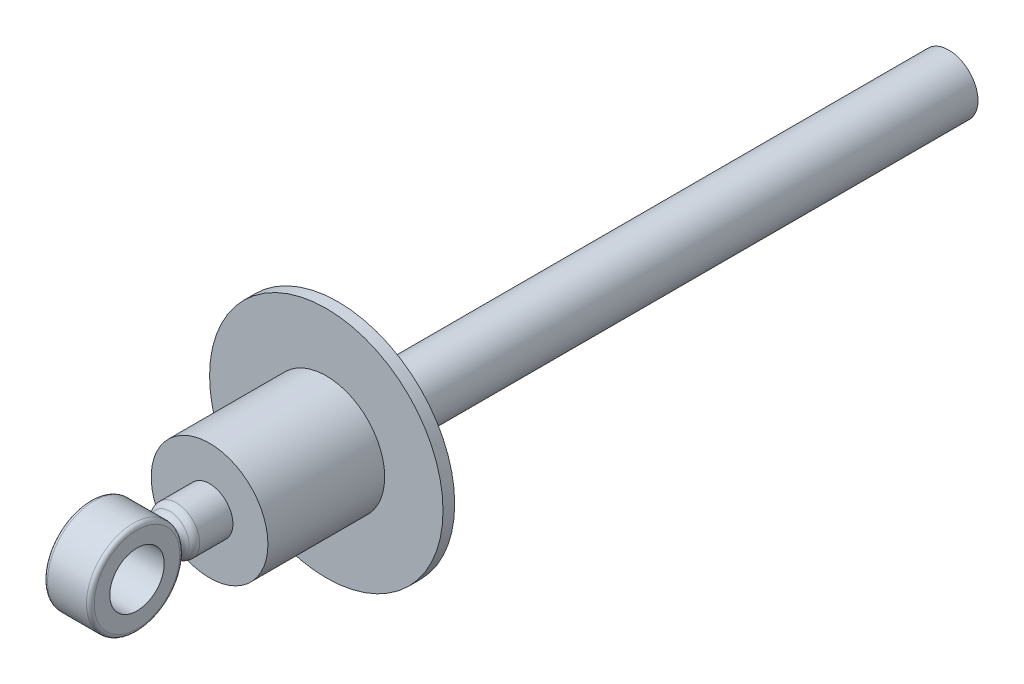
ISO-10303-21;
HEADER;
FILE_DESCRIPTION(('STEP AP214'),'2;1');
FILE_NAME('part.step','',(''),(''),'','','');
FILE_SCHEMA(('AUTOMOTIVE_DESIGN { 1 0 10303 214 1 1 1 1 }'));
ENDSEC;
DATA;
#1=APPLICATION_CONTEXT('core data for automotive mechanical design processes');
#2=APPLICATION_PROTOCOL_DEFINITION('international standard','automotive_design',2000,#1);
#3=PRODUCT_CONTEXT('',#1,'mechanical');
#4=PRODUCT('Part','Part','',(#3));
#5=PRODUCT_RELATED_PRODUCT_CATEGORY('part','',(#4));
#6=PRODUCT_DEFINITION_FORMATION('','',#4);
#7=PRODUCT_DEFINITION_CONTEXT('part definition',#1,'design');
#8=PRODUCT_DEFINITION('design','',#6,#7);
#9=PRODUCT_DEFINITION_SHAPE('','',#8);
#10=(LENGTH_UNIT() NAMED_UNIT(*) SI_UNIT(.MILLI.,.METRE.));
#11=(NAMED_UNIT(*) PLANE_ANGLE_UNIT() SI_UNIT($,.RADIAN.));
#12=(NAMED_UNIT(*) SI_UNIT($,.STERADIAN.) SOLID_ANGLE_UNIT());
#13=UNCERTAINTY_MEASURE_WITH_UNIT(LENGTH_MEASURE(1.E-05),#10,'distance_accuracy_value','');
#14=(GEOMETRIC_REPRESENTATION_CONTEXT(3) GLOBAL_UNCERTAINTY_ASSIGNED_CONTEXT((#13)) GLOBAL_UNIT_ASSIGNED_CONTEXT((#10,
#11,#12)) REPRESENTATION_CONTEXT('',''));
#15=CARTESIAN_POINT('',(0.,0.,0.));
#16=DIRECTION('',(0.,0.,1.));
#17=DIRECTION('',(1.,0.,0.));
#18=AXIS2_PLACEMENT_3D('',#15,#16,#17);
#19=CARTESIAN_POINT('',(0.,0.,45.));
#20=DIRECTION('',(0.,0.,1.));
#21=DIRECTION('',(1.,0.,0.));
#22=AXIS2_PLACEMENT_3D('',#19,#20,#21);
#23=TOROIDAL_SURFACE('',#22,5.99999999999999,2.);
#24=CARTESIAN_POINT('',(0.,0.,43.2679491924311));
#25=DIRECTION('',(0.,0.,1.));
#26=DIRECTION('',(1.,0.,0.));
#27=AXIS2_PLACEMENT_3D('',#24,#25,#26);
#28=CIRCLE('',#27,4.99999999999999);
#29=CARTESIAN_POINT('',(4.99999999999999,0.,43.2679491924311));
#30=VERTEX_POINT('',#29);
#31=EDGE_CURVE('E54',#30,#30,#28,.T.);
#32=ORIENTED_EDGE('',*,*,#31,.T.);
#33=EDGE_LOOP('',(#32));
#34=FACE_BOUND('',#33,.T.);
#35=CARTESIAN_POINT('',(0.,-5.14285714285714,46.8070158058105));
#36=CARTESIAN_POINT('',(-0.00683111749324556,-5.14052435807165,46.8059092913341));
#37=CARTESIAN_POINT('',(-0.0136583637473642,-5.13818142762443,46.8047988631425));
#38=CARTESIAN_POINT('',(-0.335580244608796,-5.02716482713573,46.7522261730405));
#39=CARTESIAN_POINT('',(-0.642346757593832,-4.89688351275064,46.6924861731305));
#40=CARTESIAN_POINT('',(-1.23309973829816,-4.59429567252462,46.5621982388673));
#41=CARTESIAN_POINT('',(-1.51701026877153,-4.42185616688589,46.4916163730789));
#42=CARTESIAN_POINT('',(-1.94131291128151,-4.11739258260238,46.3769640915469));
#43=CARTESIAN_POINT('',(-2.09186159735177,-3.99885559588693,46.3342230827016));
#44=CARTESIAN_POINT('',(-2.3813634694683,-3.74821800158512,46.2487422969961));
#45=CARTESIAN_POINT('',(-2.5203136597493,-3.61611390929359,46.206002523287));
#46=CARTESIAN_POINT('',(-2.78460190641965,-3.33898303281907,46.1220941041838));
#47=CARTESIAN_POINT('',(-2.90996689644323,-3.19398289573469,46.080922459067));
#48=CARTESIAN_POINT('',(-3.14548199154384,-2.89137923084167,46.0016065469169));
#49=CARTESIAN_POINT('',(-3.25564007927439,-2.73378238463664,45.9634606960429));
#50=CARTESIAN_POINT('',(-3.42718546024446,-2.45756807804625,45.9028899676105));
#51=CARTESIAN_POINT('',(-3.49310583124392,-2.34201109136351,45.8792572731466));
#52=CARTESIAN_POINT('',(-3.61599679202214,-2.10574311970343,45.8347005580976));
#53=CARTESIAN_POINT('',(-3.67296969690021,-1.9850334782569,45.8137758370892));
#54=CARTESIAN_POINT('',(-3.77721359017425,-1.73908739160127,45.7751450801142));
#55=CARTESIAN_POINT('',(-3.82449127352673,-1.61385414089618,45.7574368240161));
#56=CARTESIAN_POINT('',(-3.90870796259826,-1.35948901073663,45.7256793661804));
#57=CARTESIAN_POINT('',(-3.94564664845106,-1.23035701080017,45.7116302776505));
#58=CARTESIAN_POINT('',(-4.00876295332118,-0.968306734795571,45.6875140700542));
#59=CARTESIAN_POINT('',(-4.03487629795948,-0.835370716444227,45.6774707477906));
#60=CARTESIAN_POINT('',(-4.07555634616853,-0.567479842883745,45.6617853992216));
#61=CARTESIAN_POINT('',(-4.09012309124363,-0.432524994933084,45.6561433570957));
#62=CARTESIAN_POINT('',(-4.107429318612,-0.161768821570033,45.6494370762664));
#63=CARTESIAN_POINT('',(-4.11017101728584,-0.0259676595621044,45.6483719797016));
#64=CARTESIAN_POINT('',(-4.10377818666668,0.24530638929919,45.6508516033654));
#65=CARTESIAN_POINT('',(-4.09464442786165,0.380779296878615,45.6543960245252));
#66=CARTESIAN_POINT('',(-4.06605733306883,0.637867112046798,45.6654493681798));
#67=CARTESIAN_POINT('',(-4.04762622913971,0.759614425013111,45.6725652790121));
#68=CARTESIAN_POINT('',(-4.00139374242212,1.0010943181948,45.6903284565737));
#69=CARTESIAN_POINT('',(-3.9735892119393,1.12082620741017,45.7009769095483));
#70=CARTESIAN_POINT('',(-3.90902268875569,1.35745605937314,45.7255431963023));
#71=CARTESIAN_POINT('',(-3.87226358275281,1.47435492208096,45.7394599764151));
#72=CARTESIAN_POINT('',(-3.79025397499751,1.70477418824992,45.7702527744465));
#73=CARTESIAN_POINT('',(-3.74500018407979,1.81829326325503,45.7871299384674));
#74=CARTESIAN_POINT('',(-3.64434397221687,2.0463732501302,45.8242937976275));
#75=CARTESIAN_POINT('',(-3.58857888268624,2.160754736009,45.844699004144));
#76=CARTESIAN_POINT('',(-3.46899916644014,2.3847763979582,45.8879086267664));
#77=CARTESIAN_POINT('',(-3.40518168466354,2.49441487373741,45.9107138933609));
#78=CARTESIAN_POINT('',(-3.20256959331843,2.81568020900063,45.9820622227514));
#79=CARTESIAN_POINT('',(-3.05259394876391,3.01970462296468,46.0335458874293));
#80=CARTESIAN_POINT('',(-2.70005980001911,3.43815477613117,46.1498048165213));
#81=CARTESIAN_POINT('',(-2.49289656363481,3.64845457015605,46.2153519274731));
#82=CARTESIAN_POINT('',(-2.05090817438701,4.03704290639227,46.3467059015302));
#83=CARTESIAN_POINT('',(-1.81609111864845,4.2153407804623,46.4125126831757));
#84=CARTESIAN_POINT('',(-1.29226394727627,4.56016048490099,46.547600177304));
#85=CARTESIAN_POINT('',(-1.0001632955251,4.72226416844513,46.6162498003347));
#86=CARTESIAN_POINT('',(-0.529404951753644,4.94094752581378,46.7131948988569));
#87=CARTESIAN_POINT('',(-0.358329742931136,5.01232606959691,46.745822226936));
#88=CARTESIAN_POINT('',(-0.130030889748401,5.0973059289302,46.7855030703031));
#89=CARTESIAN_POINT('',(-0.0753885520291957,5.11689340639666,46.7947179468797));
#90=CARTESIAN_POINT('',(-0.0136585437800164,5.13818136715395,46.8047988126903));
#91=CARTESIAN_POINT('',(-0.00683129991445087,5.14052429759002,46.8059092399264));
#92=CARTESIAN_POINT('',(0.,5.14285714285714,46.8070158058105));
#93=B_SPLINE_CURVE_WITH_KNOTS('',3,(#35,#36,#37,#38,#39,#40,#41,#42,#43,#44,#45,#46,#47,#48,#49,
#50,#51,#52,#53,#54,#55,#56,#57,#58,#59,#60,#61,#62,#63,#64,#65,#66,#67,#68,#69,#70,#71,#72,#73,
#74,#75,#76,#77,#78,#79,#80,#81,#82,#83,#84,#85,#86,#87,#88,#89,#90,#91,#92),.UNSPECIFIED.,.F.,
.F.,(4,2,2,2,2,2,2,2,2,2,2,2,2,2,2,2,2,2,2,2,2,2,2,2,2,2,2,2,4),(0.,0.0219089296133538,
1.03365282671302,2.04863020743648,2.63689710753993,3.22531548343115,3.81254506952142,
4.39946521572908,4.80444984677477,5.20932951739372,5.61392865312212,6.01854030489112,
6.42552103150027,6.83250029520701,7.23940327505774,7.64627985607637,8.01587563724663,
8.38559565637132,8.75519664574403,9.12494104194332,9.51117946953517,9.89755522891445,
10.6701497292178,11.5740573167135,12.477700892211,13.4968467832185,14.0609376623048,
14.2372416685143,14.2591505981277),.UNSPECIFIED.);
#94=CARTESIAN_POINT('',(0.,-5.14285714285714,46.8070158058105));
#95=VERTEX_POINT('',#94);
#96=CARTESIAN_POINT('',(0.,5.14285714285714,46.8070158058105));
#97=VERTEX_POINT('',#96);
#98=EDGE_CURVE('E62',#95,#97,#93,.T.);
#99=ORIENTED_EDGE('',*,*,#98,.T.);
#100=CARTESIAN_POINT('',(0.,5.14285714285714,46.8070158058105));
#101=CARTESIAN_POINT('',(0.00683111749324556,5.14052435807165,46.8059092913341));
#102=CARTESIAN_POINT('',(0.0136583637473642,5.13818142762443,46.8047988631425));
#103=CARTESIAN_POINT('',(0.335580244608796,5.02716482713573,46.7522261730405));
#104=CARTESIAN_POINT('',(0.642346757593832,4.89688351275064,46.6924861731305));
#105=CARTESIAN_POINT('',(1.23309973829816,4.59429567252462,46.5621982388673));
#106=CARTESIAN_POINT('',(1.51701026877153,4.42185616688589,46.4916163730789));
#107=CARTESIAN_POINT('',(1.94131291128151,4.11739258260238,46.3769640915469));
#108=CARTESIAN_POINT('',(2.09186159735177,3.99885559588693,46.3342230827016));
#109=CARTESIAN_POINT('',(2.3813634694683,3.74821800158512,46.2487422969961));
#110=CARTESIAN_POINT('',(2.5203136597493,3.61611390929359,46.206002523287));
#111=CARTESIAN_POINT('',(2.78460190641965,3.33898303281907,46.1220941041838));
#112=CARTESIAN_POINT('',(2.90996689644323,3.19398289573469,46.080922459067));
#113=CARTESIAN_POINT('',(3.14548199154384,2.89137923084167,46.0016065469169));
#114=CARTESIAN_POINT('',(3.25564007927439,2.73378238463664,45.9634606960429));
#115=CARTESIAN_POINT('',(3.42718546024446,2.45756807804625,45.9028899676105));
#116=CARTESIAN_POINT('',(3.49310583124392,2.34201109136351,45.8792572731466));
#117=CARTESIAN_POINT('',(3.61599679202214,2.10574311970343,45.8347005580976));
#118=CARTESIAN_POINT('',(3.67296969690021,1.9850334782569,45.8137758370892));
#119=CARTESIAN_POINT('',(3.77721359017425,1.73908739160127,45.7751450801142));
#120=CARTESIAN_POINT('',(3.82449127352673,1.61385414089618,45.7574368240161));
#121=CARTESIAN_POINT('',(3.90870796259826,1.35948901073663,45.7256793661804));
#122=CARTESIAN_POINT('',(3.94564664845106,1.23035701080017,45.7116302776505));
#123=CARTESIAN_POINT('',(4.00876295332118,0.968306734795571,45.6875140700542));
#124=CARTESIAN_POINT('',(4.03487629795948,0.835370716444227,45.6774707477906));
#125=CARTESIAN_POINT('',(4.07555634616853,0.567479842883745,45.6617853992216));
#126=CARTESIAN_POINT('',(4.09012309124363,0.432524994933084,45.6561433570957));
#127=CARTESIAN_POINT('',(4.107429318612,0.161768821570033,45.6494370762664));
#128=CARTESIAN_POINT('',(4.11017101728584,0.0259676595621044,45.6483719797016));
#129=CARTESIAN_POINT('',(4.10377818666668,-0.24530638929919,45.6508516033654));
#130=CARTESIAN_POINT('',(4.09464442786165,-0.380779296878615,45.6543960245252));
#131=CARTESIAN_POINT('',(4.06605733306883,-0.637867112046798,45.6654493681798));
#132=CARTESIAN_POINT('',(4.04762622913971,-0.759614425013111,45.6725652790121));
#133=CARTESIAN_POINT('',(4.00139374242212,-1.0010943181948,45.6903284565737));
#134=CARTESIAN_POINT('',(3.9735892119393,-1.12082620741017,45.7009769095483));
#135=CARTESIAN_POINT('',(3.90902268875569,-1.35745605937314,45.7255431963023));
#136=CARTESIAN_POINT('',(3.87226358275281,-1.47435492208096,45.7394599764151));
#137=CARTESIAN_POINT('',(3.79025397499751,-1.70477418824992,45.7702527744465));
#138=CARTESIAN_POINT('',(3.74500018407979,-1.81829326325503,45.7871299384674));
#139=CARTESIAN_POINT('',(3.64434397221687,-2.0463732501302,45.8242937976275));
#140=CARTESIAN_POINT('',(3.58857888268624,-2.160754736009,45.844699004144));
#141=CARTESIAN_POINT('',(3.46899916644014,-2.3847763979582,45.8879086267664));
#142=CARTESIAN_POINT('',(3.40518168466354,-2.49441487373741,45.9107138933609));
#143=CARTESIAN_POINT('',(3.20256959331843,-2.81568020900063,45.9820622227514));
#144=CARTESIAN_POINT('',(3.05259394876391,-3.01970462296468,46.0335458874293));
#145=CARTESIAN_POINT('',(2.70005980001911,-3.43815477613117,46.1498048165213));
#146=CARTESIAN_POINT('',(2.49289656363481,-3.64845457015605,46.2153519274731));
#147=CARTESIAN_POINT('',(2.05090817438701,-4.03704290639227,46.3467059015302));
#148=CARTESIAN_POINT('',(1.81609111864845,-4.2153407804623,46.4125126831757));
#149=CARTESIAN_POINT('',(1.29226394727627,-4.56016048490099,46.547600177304));
#150=CARTESIAN_POINT('',(1.0001632955251,-4.72226416844513,46.6162498003347));
#151=CARTESIAN_POINT('',(0.529404951753644,-4.94094752581378,46.7131948988569));
#152=CARTESIAN_POINT('',(0.358329742931136,-5.01232606959691,46.745822226936));
#153=CARTESIAN_POINT('',(0.130030889748401,-5.0973059289302,46.7855030703031));
#154=CARTESIAN_POINT('',(0.0753885520291957,-5.11689340639666,46.7947179468797));
#155=CARTESIAN_POINT('',(0.0136585437800164,-5.13818136715395,46.8047988126903));
#156=CARTESIAN_POINT('',(0.00683129991445087,-5.14052429759002,46.8059092399264));
#157=CARTESIAN_POINT('',(0.,-5.14285714285714,46.8070158058105));
#158=B_SPLINE_CURVE_WITH_KNOTS('',3,(#100,#101,#102,#103,#104,#105,#106,#107,#108,#109,#110,
#111,#112,#113,#114,#115,#116,#117,#118,#119,#120,#121,#122,#123,#124,#125,#126,#127,#128,#129,
#130,#131,#132,#133,#134,#135,#136,#137,#138,#139,#140,#141,#142,#143,#144,#145,#146,#147,#148,
#149,#150,#151,#152,#153,#154,#155,#156,#157),.UNSPECIFIED.,.F.,.F.,(4,2,2,2,2,2,2,2,2,2,2,2,2,
2,2,2,2,2,2,2,2,2,2,2,2,2,2,2,4),(0.,0.0219089296133538,1.03365282671302,2.04863020743648,
2.63689710753993,3.22531548343115,3.81254506952142,4.39946521572908,4.80444984677477,
5.20932951739372,5.61392865312212,6.01854030489112,6.42552103150027,6.83250029520701,
7.23940327505774,7.64627985607637,8.01587563724663,8.38559565637132,8.75519664574403,
9.12494104194332,9.51117946953517,9.89755522891445,10.6701497292178,11.5740573167135,
12.477700892211,13.4968467832185,14.0609376623048,14.2372416685143,14.2591505981277),.UNSPECIFIED.);
#159=EDGE_CURVE('E61',#97,#95,#158,.T.);
#160=ORIENTED_EDGE('',*,*,#159,.T.);
#161=EDGE_LOOP('',(#99,#160));
#162=FACE_BOUND('',#161,.T.);
#163=ADVANCED_FACE('F50',(#34,#162),#23,.F.);
#164=CARTESIAN_POINT('',(0.,0.,-157.));
#165=DIRECTION('',(0.,0.,-1.));
#166=DIRECTION('',(-1.,0.,0.));
#167=AXIS2_PLACEMENT_3D('',#164,#165,#166);
#168=PLANE('',#167);
#169=CARTESIAN_POINT('',(0.,0.,-157.));
#170=DIRECTION('',(0.,0.,1.));
#171=DIRECTION('',(1.,0.,0.));
#172=AXIS2_PLACEMENT_3D('',#169,#170,#171);
#173=CIRCLE('',#172,7.50000000000002);
#174=CARTESIAN_POINT('',(7.50000000000002,0.,-157.));
#175=VERTEX_POINT('',#174);
#176=EDGE_CURVE('E133',#175,#175,#173,.T.);
#177=ORIENTED_EDGE('',*,*,#176,.F.);
#178=EDGE_LOOP('',(#177));
#179=FACE_BOUND('',#178,.T.);
#180=ADVANCED_FACE('F108',(#179),#168,.T.);
#181=CARTESIAN_POINT('',(0.,0.,49.6932132443502));
#182=DIRECTION('',(0.,0.,1.));
#183=DIRECTION('',(1.,0.,0.));
#184=AXIS2_PLACEMENT_3D('',#181,#182,#183);
#185=CYLINDRICAL_SURFACE('',#184,7.50000000000002);
#186=ORIENTED_EDGE('',*,*,#176,.T.);
#187=EDGE_LOOP('',(#186));
#188=FACE_BOUND('',#187,.T.);
#189=CARTESIAN_POINT('',(0.,0.,-3.));
#190=DIRECTION('',(0.,0.,1.));
#191=DIRECTION('',(1.,0.,0.));
#192=AXIS2_PLACEMENT_3D('',#189,#190,#191);
#193=CIRCLE('',#192,7.50000000000001);
#194=CARTESIAN_POINT('',(7.50000000000001,0.,-3.));
#195=VERTEX_POINT('',#194);
#196=EDGE_CURVE('E136',#195,#195,#193,.T.);
#197=ORIENTED_EDGE('',*,*,#196,.F.);
#198=EDGE_LOOP('',(#197));
#199=FACE_BOUND('',#198,.T.);
#200=ADVANCED_FACE('F113',(#188,#199),#185,.T.);
#201=CARTESIAN_POINT('',(0.,0.,-3.));
#202=DIRECTION('',(0.,0.,-1.));
#203=DIRECTION('',(-1.,0.,0.));
#204=AXIS2_PLACEMENT_3D('',#201,#202,#203);
#205=PLANE('',#204);
#206=ORIENTED_EDGE('',*,*,#196,.T.);
#207=EDGE_LOOP('',(#206));
#208=FACE_BOUND('',#207,.T.);
#209=CARTESIAN_POINT('',(0.,0.,-3.));
#210=DIRECTION('',(0.,0.,1.));
#211=DIRECTION('',(1.,0.,0.));
#212=AXIS2_PLACEMENT_3D('',#209,#210,#211);
#213=CIRCLE('',#212,20.);
#214=CARTESIAN_POINT('',(20.,0.,-3.));
#215=VERTEX_POINT('',#214);
#216=EDGE_CURVE('E137',#215,#215,#213,.T.);
#217=ORIENTED_EDGE('',*,*,#216,.F.);
#218=EDGE_LOOP('',(#217));
#219=FACE_BOUND('',#218,.T.);
#220=ADVANCED_FACE('F185',(#208,#219),#205,.T.);
#221=CARTESIAN_POINT('',(0.,0.,49.6932132443502));
#222=DIRECTION('',(0.,0.,1.));
#223=DIRECTION('',(1.,0.,0.));
#224=AXIS2_PLACEMENT_3D('',#221,#222,#223);
#225=CYLINDRICAL_SURFACE('',#224,20.);
#226=ORIENTED_EDGE('',*,*,#216,.T.);
#227=EDGE_LOOP('',(#226));
#228=FACE_BOUND('',#227,.T.);
#229=CARTESIAN_POINT('',(0.,0.,0.));
#230=DIRECTION('',(0.,0.,1.));
#231=DIRECTION('',(1.,0.,0.));
#232=AXIS2_PLACEMENT_3D('',#229,#230,#231);
#233=CIRCLE('',#232,20.);
#234=CARTESIAN_POINT('',(20.,0.,0.));
#235=VERTEX_POINT('',#234);
#236=EDGE_CURVE('E141',#235,#235,#233,.T.);
#237=ORIENTED_EDGE('',*,*,#236,.F.);
#238=EDGE_LOOP('',(#237));
#239=FACE_BOUND('',#238,.T.);
#240=ADVANCED_FACE('F180',(#228,#239),#225,.T.);
#241=CARTESIAN_POINT('',(0.,0.,0.));
#242=DIRECTION('',(0.,0.,-1.));
#243=DIRECTION('',(-1.,0.,0.));
#244=AXIS2_PLACEMENT_3D('',#241,#242,#243);
#245=PLANE('',#244);
#246=ORIENTED_EDGE('',*,*,#236,.T.);
#247=EDGE_LOOP('',(#246));
#248=FACE_BOUND('',#247,.T.);
#249=CARTESIAN_POINT('',(0.,0.,0.));
#250=DIRECTION('',(0.,0.,1.));
#251=DIRECTION('',(1.,0.,0.));
#252=AXIS2_PLACEMENT_3D('',#249,#250,#251);
#253=CIRCLE('',#252,30.);
#254=CARTESIAN_POINT('',(30.,0.,0.));
#255=VERTEX_POINT('',#254);
#256=EDGE_CURVE('E148',#255,#255,#253,.T.);
#257=ORIENTED_EDGE('',*,*,#256,.F.);
#258=EDGE_LOOP('',(#257));
#259=FACE_BOUND('',#258,.T.);
#260=ADVANCED_FACE('F173',(#248,#259),#245,.T.);
#261=CARTESIAN_POINT('',(0.,0.,49.6932132443502));
#262=DIRECTION('',(0.,0.,1.));
#263=DIRECTION('',(1.,0.,0.));
#264=AXIS2_PLACEMENT_3D('',#261,#262,#263);
#265=CYLINDRICAL_SURFACE('',#264,30.);
#266=ORIENTED_EDGE('',*,*,#256,.T.);
#267=EDGE_LOOP('',(#266));
#268=FACE_BOUND('',#267,.T.);
#269=CARTESIAN_POINT('',(0.,0.,3.));
#270=DIRECTION('',(0.,0.,1.));
#271=DIRECTION('',(1.,0.,0.));
#272=AXIS2_PLACEMENT_3D('',#269,#270,#271);
#273=CIRCLE('',#272,30.);
#274=CARTESIAN_POINT('',(30.,0.,3.));
#275=VERTEX_POINT('',#274);
#276=EDGE_CURVE('E149',#275,#275,#273,.T.);
#277=ORIENTED_EDGE('',*,*,#276,.F.);
#278=EDGE_LOOP('',(#277));
#279=FACE_BOUND('',#278,.T.);
#280=ADVANCED_FACE('F169',(#268,#279),#265,.T.);
#281=CARTESIAN_POINT('',(0.,0.,3.));
#282=DIRECTION('',(0.,0.,1.));
#283=DIRECTION('',(1.,0.,0.));
#284=AXIS2_PLACEMENT_3D('',#281,#282,#283);
#285=PLANE('',#284);
#286=ORIENTED_EDGE('',*,*,#276,.T.);
#287=EDGE_LOOP('',(#286));
#288=FACE_BOUND('',#287,.T.);
#289=CARTESIAN_POINT('',(0.,0.,3.));
#290=DIRECTION('',(0.,0.,1.));
#291=DIRECTION('',(1.,0.,0.));
#292=AXIS2_PLACEMENT_3D('',#289,#290,#291);
#293=CIRCLE('',#292,15.);
#294=CARTESIAN_POINT('',(15.,0.,3.));
#295=VERTEX_POINT('',#294);
#296=EDGE_CURVE('E155',#295,#295,#293,.T.);
#297=ORIENTED_EDGE('',*,*,#296,.F.);
#298=EDGE_LOOP('',(#297));
#299=FACE_BOUND('',#298,.T.);
#300=ADVANCED_FACE('F161',(#288,#299),#285,.T.);
#301=CARTESIAN_POINT('',(0.,0.,49.6932132443502));
#302=DIRECTION('',(0.,0.,1.));
#303=DIRECTION('',(1.,0.,0.));
#304=AXIS2_PLACEMENT_3D('',#301,#302,#303);
#305=CYLINDRICAL_SURFACE('',#304,15.);
#306=ORIENTED_EDGE('',*,*,#296,.T.);
#307=EDGE_LOOP('',(#306));
#308=FACE_BOUND('',#307,.T.);
#309=CARTESIAN_POINT('',(0.,0.,33.));
#310=DIRECTION('',(0.,0.,1.));
#311=DIRECTION('',(1.,0.,0.));
#312=AXIS2_PLACEMENT_3D('',#309,#310,#311);
#313=CIRCLE('',#312,15.);
#314=CARTESIAN_POINT('',(15.,0.,33.));
#315=VERTEX_POINT('',#314);
#316=EDGE_CURVE('E72',#315,#315,#313,.T.);
#317=ORIENTED_EDGE('',*,*,#316,.F.);
#318=EDGE_LOOP('',(#317));
#319=FACE_BOUND('',#318,.T.);
#320=ADVANCED_FACE('F157',(#308,#319),#305,.T.);
#321=CARTESIAN_POINT('',(0.,0.,33.));
#322=DIRECTION('',(0.,0.,1.));
#323=DIRECTION('',(1.,0.,0.));
#324=AXIS2_PLACEMENT_3D('',#321,#322,#323);
#325=PLANE('',#324);
#326=ORIENTED_EDGE('',*,*,#316,.T.);
#327=EDGE_LOOP('',(#326));
#328=FACE_BOUND('',#327,.T.);
#329=CARTESIAN_POINT('',(0.,0.,33.));
#330=DIRECTION('',(0.,0.,1.));
#331=DIRECTION('',(1.,0.,0.));
#332=AXIS2_PLACEMENT_3D('',#329,#330,#331);
#333=CIRCLE('',#332,6.);
#334=CARTESIAN_POINT('',(6.,0.,33.));
#335=VERTEX_POINT('',#334);
#336=EDGE_CURVE('E70',#335,#335,#333,.T.);
#337=ORIENTED_EDGE('',*,*,#336,.F.);
#338=EDGE_LOOP('',(#337));
#339=FACE_BOUND('',#338,.T.);
#340=ADVANCED_FACE('F102',(#328,#339),#325,.T.);
#341=CARTESIAN_POINT('',(0.,0.,49.6932132443502));
#342=DIRECTION('',(0.,0.,1.));
#343=DIRECTION('',(1.,0.,0.));
#344=AXIS2_PLACEMENT_3D('',#341,#342,#343);
#345=CYLINDRICAL_SURFACE('',#344,6.);
#346=CARTESIAN_POINT('',(0.,0.,41.5358983848623));
#347=DIRECTION('',(0.,0.,-1.));
#348=DIRECTION('',(-1.,0.,0.));
#349=AXIS2_PLACEMENT_3D('',#346,#347,#348);
#350=CIRCLE('',#349,6.);
#351=CARTESIAN_POINT('',(-6.,0.,41.5358983848623));
#352=VERTEX_POINT('',#351);
#353=EDGE_CURVE('E11',#352,#352,#350,.T.);
#354=ORIENTED_EDGE('',*,*,#353,.T.);
#355=EDGE_LOOP('',(#354));
#356=FACE_BOUND('',#355,.T.);
#357=ORIENTED_EDGE('',*,*,#336,.T.);
#358=EDGE_LOOP('',(#357));
#359=FACE_BOUND('',#358,.T.);
#360=ADVANCED_FACE('F98',(#356,#359),#345,.T.);
#361=CARTESIAN_POINT('',(6.,0.,57.6491106406735));
#362=DIRECTION('',(-1.,0.,0.));
#363=DIRECTION('',(0.,0.,1.));
#364=AXIS2_PLACEMENT_3D('',#361,#362,#363);
#365=CYLINDRICAL_SURFACE('',#364,7.);
#366=CARTESIAN_POINT('',(6.,0.,57.6491106406735));
#367=DIRECTION('',(1.,0.,0.));
#368=DIRECTION('',(0.,0.,-1.));
#369=AXIS2_PLACEMENT_3D('',#366,#367,#368);
#370=CIRCLE('',#369,7.);
#371=CARTESIAN_POINT('',(6.,0.,50.6491106406735));
#372=VERTEX_POINT('',#371);
#373=EDGE_CURVE('E69',#372,#372,#370,.T.);
#374=ORIENTED_EDGE('',*,*,#373,.T.);
#375=EDGE_LOOP('',(#374));
#376=FACE_BOUND('',#375,.T.);
#377=CARTESIAN_POINT('',(-6.,0.,57.6491106406735));
#378=DIRECTION('',(1.,0.,0.));
#379=DIRECTION('',(0.,0.,-1.));
#380=AXIS2_PLACEMENT_3D('',#377,#378,#379);
#381=CIRCLE('',#380,7.);
#382=CARTESIAN_POINT('',(-6.,0.,50.6491106406735));
#383=VERTEX_POINT('',#382);
#384=EDGE_CURVE('E206',#383,#383,#381,.T.);
#385=ORIENTED_EDGE('',*,*,#384,.F.);
#386=EDGE_LOOP('',(#385));
#387=FACE_BOUND('',#386,.T.);
#388=ADVANCED_FACE('F95',(#376,#387),#365,.F.);
#389=CARTESIAN_POINT('',(6.,0.,57.6491106406735));
#390=DIRECTION('',(-1.,0.,0.));
#391=DIRECTION('',(0.,0.,1.));
#392=AXIS2_PLACEMENT_3D('',#389,#390,#391);
#393=CYLINDRICAL_SURFACE('',#392,12.);
#394=CARTESIAN_POINT('',(-5.,0.,57.6491106406735));
#395=DIRECTION('',(1.,0.,0.));
#396=DIRECTION('',(0.,0.,-1.));
#397=AXIS2_PLACEMENT_3D('',#394,#395,#396);
#398=CIRCLE('',#397,12.);
#399=CARTESIAN_POINT('',(-5.,0.,45.6491106406735));
#400=VERTEX_POINT('',#399);
#401=EDGE_CURVE('E126',#400,#400,#398,.T.);
#402=ORIENTED_EDGE('',*,*,#401,.T.);
#403=EDGE_LOOP('',(#402));
#404=FACE_BOUND('',#403,.T.);
#405=CARTESIAN_POINT('',(5.,0.,57.6491106406735));
#406=DIRECTION('',(1.,0.,0.));
#407=DIRECTION('',(0.,0.,-1.));
#408=AXIS2_PLACEMENT_3D('',#405,#406,#407);
#409=CIRCLE('',#408,12.);
#410=CARTESIAN_POINT('',(5.,0.,45.6491106406735));
#411=VERTEX_POINT('',#410);
#412=EDGE_CURVE('E131',#411,#411,#409,.F.);
#413=ORIENTED_EDGE('',*,*,#412,.T.);
#414=EDGE_LOOP('',(#413));
#415=FACE_BOUND('',#414,.T.);
#416=ORIENTED_EDGE('',*,*,#159,.F.);
#417=ORIENTED_EDGE('',*,*,#98,.F.);
#418=EDGE_LOOP('',(#416,#417));
#419=FACE_BOUND('',#418,.T.);
#420=ADVANCED_FACE('F63',(#404,#415,#419),#393,.T.);
#421=CARTESIAN_POINT('',(6.,0.,0.));
#422=DIRECTION('',(1.,0.,0.));
#423=DIRECTION('',(0.,0.,-1.));
#424=AXIS2_PLACEMENT_3D('',#421,#422,#423);
#425=PLANE('',#424);
#426=CARTESIAN_POINT('',(6.,0.,57.6491106406735));
#427=DIRECTION('',(1.,0.,0.));
#428=DIRECTION('',(0.,0.,-1.));
#429=AXIS2_PLACEMENT_3D('',#426,#427,#428);
#430=CIRCLE('',#429,11.);
#431=CARTESIAN_POINT('',(6.,0.,46.6491106406735));
#432=VERTEX_POINT('',#431);
#433=EDGE_CURVE('E124',#432,#432,#430,.T.);
#434=ORIENTED_EDGE('',*,*,#433,.T.);
#435=EDGE_LOOP('',(#434));
#436=FACE_BOUND('',#435,.T.);
#437=ORIENTED_EDGE('',*,*,#373,.F.);
#438=EDGE_LOOP('',(#437));
#439=FACE_BOUND('',#438,.T.);
#440=ADVANCED_FACE('F93',(#436,#439),#425,.T.);
#441=CARTESIAN_POINT('',(-6.,0.,0.));
#442=DIRECTION('',(1.,0.,0.));
#443=DIRECTION('',(0.,0.,-1.));
#444=AXIS2_PLACEMENT_3D('',#441,#442,#443);
#445=PLANE('',#444);
#446=CARTESIAN_POINT('',(-6.,0.,57.6491106406735));
#447=DIRECTION('',(1.,0.,0.));
#448=DIRECTION('',(0.,0.,-1.));
#449=AXIS2_PLACEMENT_3D('',#446,#447,#448);
#450=CIRCLE('',#449,11.);
#451=CARTESIAN_POINT('',(-6.,0.,46.6491106406735));
#452=VERTEX_POINT('',#451);
#453=EDGE_CURVE('E125',#452,#452,#450,.F.);
#454=ORIENTED_EDGE('',*,*,#453,.T.);
#455=EDGE_LOOP('',(#454));
#456=FACE_BOUND('',#455,.T.);
#457=ORIENTED_EDGE('',*,*,#384,.T.);
#458=EDGE_LOOP('',(#457));
#459=FACE_BOUND('',#458,.T.);
#460=ADVANCED_FACE('F94',(#456,#459),#445,.F.);
#461=CARTESIAN_POINT('',(-5.,0.,57.6491106406735));
#462=DIRECTION('',(1.,0.,0.));
#463=DIRECTION('',(0.,0.,-1.));
#464=AXIS2_PLACEMENT_3D('',#461,#462,#463);
#465=TOROIDAL_SURFACE('',#464,11.,1.);
#466=ORIENTED_EDGE('',*,*,#453,.F.);
#467=EDGE_LOOP('',(#466));
#468=FACE_BOUND('',#467,.T.);
#469=ORIENTED_EDGE('',*,*,#401,.F.);
#470=EDGE_LOOP('',(#469));
#471=FACE_BOUND('',#470,.T.);
#472=ADVANCED_FACE('F189',(#468,#471),#465,.T.);
#473=CARTESIAN_POINT('',(5.,0.,57.6491106406735));
#474=DIRECTION('',(1.,0.,0.));
#475=DIRECTION('',(0.,0.,-1.));
#476=AXIS2_PLACEMENT_3D('',#473,#474,#475);
#477=TOROIDAL_SURFACE('',#476,11.,1.);
#478=ORIENTED_EDGE('',*,*,#412,.F.);
#479=EDGE_LOOP('',(#478));
#480=FACE_BOUND('',#479,.T.);
#481=ORIENTED_EDGE('',*,*,#433,.F.);
#482=EDGE_LOOP('',(#481));
#483=FACE_BOUND('',#482,.T.);
#484=ADVANCED_FACE('F191',(#480,#483),#477,.T.);
#485=CARTESIAN_POINT('',(0.,0.,41.5358983848623));
#486=DIRECTION('',(0.,0.,-1.));
#487=DIRECTION('',(-1.,0.,0.));
#488=AXIS2_PLACEMENT_3D('',#485,#486,#487);
#489=TOROIDAL_SURFACE('',#488,4.,2.);
#490=ORIENTED_EDGE('',*,*,#353,.F.);
#491=EDGE_LOOP('',(#490));
#492=FACE_BOUND('',#491,.T.);
#493=ORIENTED_EDGE('',*,*,#31,.F.);
#494=EDGE_LOOP('',(#493));
#495=FACE_BOUND('',#494,.T.);
#496=ADVANCED_FACE('F47',(#492,#495),#489,.T.);
#497=CLOSED_SHELL('',(#163,#180,#200,#220,#240,#260,#280,#300,#320,#340,#360,#388,#420,#440,
#460,#472,#484,#496));
#498=MANIFOLD_SOLID_BREP('B2',#497);
#499=ADVANCED_BREP_SHAPE_REPRESENTATION('',(#18,#498),#14);
#500=SHAPE_DEFINITION_REPRESENTATION(#9,#499);
ENDSEC;
END-ISO-10303-21;
